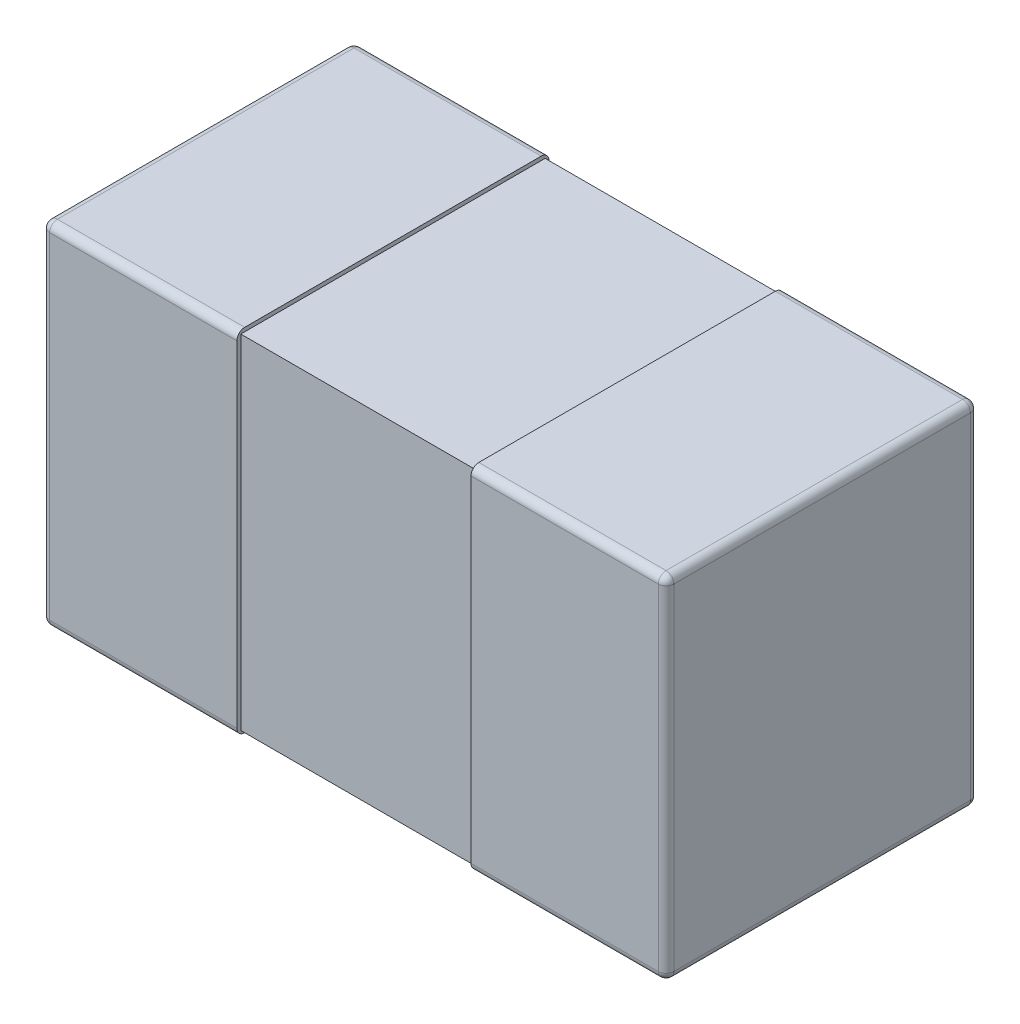
ISO-10303-21;
HEADER;
FILE_DESCRIPTION(('STEP AP214'),'2;1');
FILE_NAME('part.step','',(''),(''),'','','');
FILE_SCHEMA(('AUTOMOTIVE_DESIGN { 1 0 10303 214 1 1 1 1 }'));
ENDSEC;
DATA;
#1=APPLICATION_CONTEXT('core data for automotive mechanical design processes');
#2=APPLICATION_PROTOCOL_DEFINITION('international standard','automotive_design',2000,#1);
#3=PRODUCT_CONTEXT('',#1,'mechanical');
#4=PRODUCT('Part','Part','',(#3));
#5=PRODUCT_RELATED_PRODUCT_CATEGORY('part','',(#4));
#6=PRODUCT_DEFINITION_FORMATION('','',#4);
#7=PRODUCT_DEFINITION_CONTEXT('part definition',#1,'design');
#8=PRODUCT_DEFINITION('design','',#6,#7);
#9=PRODUCT_DEFINITION_SHAPE('','',#8);
#10=(LENGTH_UNIT() NAMED_UNIT(*) SI_UNIT(.MILLI.,.METRE.));
#11=(NAMED_UNIT(*) PLANE_ANGLE_UNIT() SI_UNIT($,.RADIAN.));
#12=(NAMED_UNIT(*) SI_UNIT($,.STERADIAN.) SOLID_ANGLE_UNIT());
#13=UNCERTAINTY_MEASURE_WITH_UNIT(LENGTH_MEASURE(1.E-05),#10,'distance_accuracy_value','');
#14=(GEOMETRIC_REPRESENTATION_CONTEXT(3) GLOBAL_UNCERTAINTY_ASSIGNED_CONTEXT((#13)) GLOBAL_UNIT_ASSIGNED_CONTEXT((#10,
#11,#12)) REPRESENTATION_CONTEXT('',''));
#15=CARTESIAN_POINT('',(0.,0.,0.));
#16=DIRECTION('',(0.,0.,1.));
#17=DIRECTION('',(1.,0.,0.));
#18=AXIS2_PLACEMENT_3D('',#15,#16,#17);
#19=CARTESIAN_POINT('',(0.8,0.9,0.4));
#20=DIRECTION('',(-1.,0.,0.));
#21=DIRECTION('',(0.,0.,1.));
#22=AXIS2_PLACEMENT_3D('',#19,#20,#21);
#23=PLANE('',#22);
#24=DIRECTION('',(0.,1.,0.));
#25=VECTOR('',#24,1.);
#26=CARTESIAN_POINT('',(0.8,0.9,-0.38));
#27=LINE('',#26,#25);
#28=CARTESIAN_POINT('',(0.8,0.88,-0.38));
#29=VERTEX_POINT('',#28);
#30=CARTESIAN_POINT('',(0.8,0.02,-0.38));
#31=VERTEX_POINT('',#30);
#32=EDGE_CURVE('E326',#29,#31,#27,.F.);
#33=ORIENTED_EDGE('',*,*,#32,.F.);
#34=DIRECTION('',(0.,0.,1.));
#35=VECTOR('',#34,1.);
#36=CARTESIAN_POINT('',(0.8,0.88,0.));
#37=LINE('',#36,#35);
#38=CARTESIAN_POINT('',(0.8,0.88,0.38));
#39=VERTEX_POINT('',#38);
#40=EDGE_CURVE('E332',#39,#29,#37,.F.);
#41=ORIENTED_EDGE('',*,*,#40,.F.);
#42=DIRECTION('',(0.,-1.,0.));
#43=VECTOR('',#42,1.);
#44=CARTESIAN_POINT('',(0.8,0.9,0.38));
#45=LINE('',#44,#43);
#46=CARTESIAN_POINT('',(0.8,0.02,0.38));
#47=VERTEX_POINT('',#46);
#48=EDGE_CURVE('E288',#47,#39,#45,.F.);
#49=ORIENTED_EDGE('',*,*,#48,.F.);
#50=DIRECTION('',(0.,0.,-1.));
#51=VECTOR('',#50,1.);
#52=CARTESIAN_POINT('',(0.8,0.02,0.4));
#53=LINE('',#52,#51);
#54=EDGE_CURVE('E341',#31,#47,#53,.F.);
#55=ORIENTED_EDGE('',*,*,#54,.F.);
#56=EDGE_LOOP('',(#33,#41,#49,#55));
#57=FACE_BOUND('',#56,.T.);
#58=ADVANCED_FACE('F17',(#57),#23,.F.);
#59=CARTESIAN_POINT('',(0.78,0.9,-0.38));
#60=DIRECTION('',(0.,1.,0.));
#61=DIRECTION('',(0.,0.,1.));
#62=AXIS2_PLACEMENT_3D('',#59,#60,#61);
#63=CYLINDRICAL_SURFACE('',#62,0.02);
#64=CARTESIAN_POINT('',(0.78,0.02,-0.38));
#65=DIRECTION('',(0.,1.,0.));
#66=DIRECTION('',(1.,0.,0.));
#67=AXIS2_PLACEMENT_3D('',#64,#65,#66);
#68=CIRCLE('',#67,0.02);
#69=CARTESIAN_POINT('',(0.78,0.02,-0.4));
#70=VERTEX_POINT('',#69);
#71=EDGE_CURVE('E322',#70,#31,#68,.F.);
#72=ORIENTED_EDGE('',*,*,#71,.F.);
#73=DIRECTION('',(0.,1.,0.));
#74=VECTOR('',#73,1.);
#75=CARTESIAN_POINT('',(0.78,0.9,-0.4));
#76=LINE('',#75,#74);
#77=CARTESIAN_POINT('',(0.78,0.88,-0.4));
#78=VERTEX_POINT('',#77);
#79=EDGE_CURVE('E246',#78,#70,#76,.F.);
#80=ORIENTED_EDGE('',*,*,#79,.F.);
#81=CARTESIAN_POINT('',(0.78,0.88,-0.38));
#82=DIRECTION('',(0.,1.,0.));
#83=DIRECTION('',(1.,0.,0.));
#84=AXIS2_PLACEMENT_3D('',#81,#82,#83);
#85=CIRCLE('',#84,0.02);
#86=EDGE_CURVE('E250',#29,#78,#85,.T.);
#87=ORIENTED_EDGE('',*,*,#86,.F.);
#88=ORIENTED_EDGE('',*,*,#32,.T.);
#89=EDGE_LOOP('',(#72,#80,#87,#88));
#90=FACE_BOUND('',#89,.T.);
#91=ADVANCED_FACE('F315',(#90),#63,.T.);
#92=CARTESIAN_POINT('',(0.78,0.02,-0.38));
#93=DIRECTION('',(1.,0.,0.));
#94=DIRECTION('',(0.,0.,-1.));
#95=AXIS2_PLACEMENT_3D('',#92,#93,#94);
#96=SPHERICAL_SURFACE('',#95,0.02);
#97=CARTESIAN_POINT('',(0.78,0.02,-0.38));
#98=DIRECTION('',(0.,0.,-1.));
#99=DIRECTION('',(-1.,0.,0.));
#100=AXIS2_PLACEMENT_3D('',#97,#98,#99);
#101=CIRCLE('',#100,0.02);
#102=CARTESIAN_POINT('',(0.78,0.,-0.38));
#103=VERTEX_POINT('',#102);
#104=EDGE_CURVE('E325',#103,#31,#101,.F.);
#105=ORIENTED_EDGE('',*,*,#104,.F.);
#106=CARTESIAN_POINT('',(0.78,0.02,-0.38));
#107=DIRECTION('',(-1.,0.,0.));
#108=DIRECTION('',(0.,0.,1.));
#109=AXIS2_PLACEMENT_3D('',#106,#107,#108);
#110=CIRCLE('',#109,0.02);
#111=EDGE_CURVE('E188',#70,#103,#110,.T.);
#112=ORIENTED_EDGE('',*,*,#111,.F.);
#113=ORIENTED_EDGE('',*,*,#71,.T.);
#114=EDGE_LOOP('',(#105,#112,#113));
#115=FACE_BOUND('',#114,.T.);
#116=ADVANCED_FACE('F311',(#115),#96,.T.);
#117=CARTESIAN_POINT('',(0.78,0.02,0.4));
#118=DIRECTION('',(0.,0.,-1.));
#119=DIRECTION('',(-1.,0.,0.));
#120=AXIS2_PLACEMENT_3D('',#117,#118,#119);
#121=CYLINDRICAL_SURFACE('',#120,0.02);
#122=ORIENTED_EDGE('',*,*,#104,.T.);
#123=ORIENTED_EDGE('',*,*,#54,.T.);
#124=CARTESIAN_POINT('',(0.78,0.02,0.38));
#125=DIRECTION('',(0.,0.,-1.));
#126=DIRECTION('',(1.,0.,0.));
#127=AXIS2_PLACEMENT_3D('',#124,#125,#126);
#128=CIRCLE('',#127,0.02);
#129=CARTESIAN_POINT('',(0.78,0.,0.38));
#130=VERTEX_POINT('',#129);
#131=EDGE_CURVE('E298',#130,#47,#128,.F.);
#132=ORIENTED_EDGE('',*,*,#131,.F.);
#133=DIRECTION('',(0.,0.,1.));
#134=VECTOR('',#133,1.);
#135=CARTESIAN_POINT('',(0.78,0.,0.));
#136=LINE('',#135,#134);
#137=EDGE_CURVE('E192',#130,#103,#136,.F.);
#138=ORIENTED_EDGE('',*,*,#137,.T.);
#139=EDGE_LOOP('',(#122,#123,#132,#138));
#140=FACE_BOUND('',#139,.T.);
#141=ADVANCED_FACE('F307',(#140),#121,.T.);
#142=CARTESIAN_POINT('',(0.78,0.02,0.38));
#143=DIRECTION('',(1.,0.,0.));
#144=DIRECTION('',(0.,0.,-1.));
#145=AXIS2_PLACEMENT_3D('',#142,#143,#144);
#146=SPHERICAL_SURFACE('',#145,0.02);
#147=CARTESIAN_POINT('',(0.78,0.02,0.38));
#148=DIRECTION('',(1.,0.,0.));
#149=DIRECTION('',(0.,0.,-1.));
#150=AXIS2_PLACEMENT_3D('',#147,#148,#149);
#151=CIRCLE('',#150,0.02);
#152=CARTESIAN_POINT('',(0.78,0.0200000000000001,0.4));
#153=VERTEX_POINT('',#152);
#154=EDGE_CURVE('E240',#130,#153,#151,.F.);
#155=ORIENTED_EDGE('',*,*,#154,.F.);
#156=ORIENTED_EDGE('',*,*,#131,.T.);
#157=CARTESIAN_POINT('',(0.78,0.0200000000000001,0.38));
#158=DIRECTION('',(0.,-1.,0.));
#159=DIRECTION('',(0.,0.,-1.));
#160=AXIS2_PLACEMENT_3D('',#157,#158,#159);
#161=CIRCLE('',#160,0.02);
#162=EDGE_CURVE('E295',#153,#47,#161,.F.);
#163=ORIENTED_EDGE('',*,*,#162,.F.);
#164=EDGE_LOOP('',(#155,#156,#163));
#165=FACE_BOUND('',#164,.T.);
#166=ADVANCED_FACE('F304',(#165),#146,.T.);
#167=CARTESIAN_POINT('',(0.78,0.9,0.38));
#168=DIRECTION('',(0.,-1.,0.));
#169=DIRECTION('',(0.,0.,-1.));
#170=AXIS2_PLACEMENT_3D('',#167,#168,#169);
#171=CYLINDRICAL_SURFACE('',#170,0.02);
#172=ORIENTED_EDGE('',*,*,#162,.T.);
#173=ORIENTED_EDGE('',*,*,#48,.T.);
#174=CARTESIAN_POINT('',(0.78,0.88,0.38));
#175=DIRECTION('',(0.,-1.,0.));
#176=DIRECTION('',(1.,0.,0.));
#177=AXIS2_PLACEMENT_3D('',#174,#175,#176);
#178=CIRCLE('',#177,0.02);
#179=CARTESIAN_POINT('',(0.78,0.88,0.4));
#180=VERTEX_POINT('',#179);
#181=EDGE_CURVE('E284',#180,#39,#178,.F.);
#182=ORIENTED_EDGE('',*,*,#181,.F.);
#183=DIRECTION('',(0.,1.,0.));
#184=VECTOR('',#183,1.);
#185=CARTESIAN_POINT('',(0.78,0.9,0.4));
#186=LINE('',#185,#184);
#187=EDGE_CURVE('E236',#180,#153,#186,.F.);
#188=ORIENTED_EDGE('',*,*,#187,.T.);
#189=EDGE_LOOP('',(#172,#173,#182,#188));
#190=FACE_BOUND('',#189,.T.);
#191=ADVANCED_FACE('F276',(#190),#171,.T.);
#192=CARTESIAN_POINT('',(0.78,0.88,0.38));
#193=DIRECTION('',(1.,0.,0.));
#194=DIRECTION('',(0.,0.,-1.));
#195=AXIS2_PLACEMENT_3D('',#192,#193,#194);
#196=SPHERICAL_SURFACE('',#195,0.02);
#197=CARTESIAN_POINT('',(0.78,0.88,0.38));
#198=DIRECTION('',(-1.,0.,0.));
#199=DIRECTION('',(0.,0.,1.));
#200=AXIS2_PLACEMENT_3D('',#197,#198,#199);
#201=CIRCLE('',#200,0.02);
#202=CARTESIAN_POINT('',(0.78,0.9,0.38));
#203=VERTEX_POINT('',#202);
#204=EDGE_CURVE('E231',#180,#203,#201,.T.);
#205=ORIENTED_EDGE('',*,*,#204,.F.);
#206=ORIENTED_EDGE('',*,*,#181,.T.);
#207=CARTESIAN_POINT('',(0.78,0.88,0.38));
#208=DIRECTION('',(0.,0.,1.));
#209=DIRECTION('',(1.,0.,0.));
#210=AXIS2_PLACEMENT_3D('',#207,#208,#209);
#211=CIRCLE('',#210,0.02);
#212=EDGE_CURVE('E287',#203,#39,#211,.F.);
#213=ORIENTED_EDGE('',*,*,#212,.F.);
#214=EDGE_LOOP('',(#205,#206,#213));
#215=FACE_BOUND('',#214,.T.);
#216=ADVANCED_FACE('F271',(#215),#196,.T.);
#217=CARTESIAN_POINT('',(0.78,0.88,0.));
#218=DIRECTION('',(0.,0.,1.));
#219=DIRECTION('',(1.,0.,0.));
#220=AXIS2_PLACEMENT_3D('',#217,#218,#219);
#221=CYLINDRICAL_SURFACE('',#220,0.02);
#222=CARTESIAN_POINT('',(0.78,0.88,-0.38));
#223=DIRECTION('',(0.,0.,1.));
#224=DIRECTION('',(1.,0.,0.));
#225=AXIS2_PLACEMENT_3D('',#222,#223,#224);
#226=CIRCLE('',#225,0.02);
#227=CARTESIAN_POINT('',(0.78,0.9,-0.38));
#228=VERTEX_POINT('',#227);
#229=EDGE_CURVE('E335',#228,#29,#226,.F.);
#230=ORIENTED_EDGE('',*,*,#229,.F.);
#231=DIRECTION('',(0.,0.,1.));
#232=VECTOR('',#231,1.);
#233=CARTESIAN_POINT('',(0.78,0.9,0.));
#234=LINE('',#233,#232);
#235=EDGE_CURVE('E225',#203,#228,#234,.F.);
#236=ORIENTED_EDGE('',*,*,#235,.F.);
#237=ORIENTED_EDGE('',*,*,#212,.T.);
#238=ORIENTED_EDGE('',*,*,#40,.T.);
#239=EDGE_LOOP('',(#230,#236,#237,#238));
#240=FACE_BOUND('',#239,.T.);
#241=ADVANCED_FACE('F266',(#240),#221,.T.);
#242=CARTESIAN_POINT('',(0.78,0.88,-0.38));
#243=DIRECTION('',(1.,0.,0.));
#244=DIRECTION('',(0.,0.,-1.));
#245=AXIS2_PLACEMENT_3D('',#242,#243,#244);
#246=SPHERICAL_SURFACE('',#245,0.02);
#247=ORIENTED_EDGE('',*,*,#229,.T.);
#248=ORIENTED_EDGE('',*,*,#86,.T.);
#249=CARTESIAN_POINT('',(0.78,0.88,-0.38));
#250=DIRECTION('',(1.,0.,0.));
#251=DIRECTION('',(0.,0.,-1.));
#252=AXIS2_PLACEMENT_3D('',#249,#250,#251);
#253=CIRCLE('',#252,0.02);
#254=EDGE_CURVE('E211',#228,#78,#253,.F.);
#255=ORIENTED_EDGE('',*,*,#254,.F.);
#256=EDGE_LOOP('',(#247,#248,#255));
#257=FACE_BOUND('',#256,.T.);
#258=ADVANCED_FACE('F261',(#257),#246,.T.);
#259=CARTESIAN_POINT('',(0.3,0.9,-0.4));
#260=DIRECTION('',(0.,0.,-1.));
#261=DIRECTION('',(-1.,0.,0.));
#262=AXIS2_PLACEMENT_3D('',#259,#260,#261);
#263=PLANE('',#262);
#264=DIRECTION('',(0.,1.,0.));
#265=VECTOR('',#264,1.);
#266=CARTESIAN_POINT('',(0.3,0.9,-0.4));
#267=LINE('',#266,#265);
#268=CARTESIAN_POINT('',(0.3,0.88,-0.4));
#269=VERTEX_POINT('',#268);
#270=CARTESIAN_POINT('',(0.3,0.02,-0.4));
#271=VERTEX_POINT('',#270);
#272=EDGE_CURVE('E207',#269,#271,#267,.F.);
#273=ORIENTED_EDGE('',*,*,#272,.F.);
#274=DIRECTION('',(1.,0.,0.));
#275=VECTOR('',#274,1.);
#276=CARTESIAN_POINT('',(0.3,0.88,-0.4));
#277=LINE('',#276,#275);
#278=EDGE_CURVE('E208',#78,#269,#277,.F.);
#279=ORIENTED_EDGE('',*,*,#278,.F.);
#280=ORIENTED_EDGE('',*,*,#79,.T.);
#281=DIRECTION('',(-1.,0.,0.));
#282=VECTOR('',#281,1.);
#283=CARTESIAN_POINT('',(0.,0.02,-0.4));
#284=LINE('',#283,#282);
#285=EDGE_CURVE('E176',#271,#70,#284,.F.);
#286=ORIENTED_EDGE('',*,*,#285,.F.);
#287=EDGE_LOOP('',(#273,#279,#280,#286));
#288=FACE_BOUND('',#287,.T.);
#289=ADVANCED_FACE('F265',(#288),#263,.T.);
#290=CARTESIAN_POINT('',(0.,0.02,-0.38));
#291=DIRECTION('',(-1.,0.,0.));
#292=DIRECTION('',(0.,0.,1.));
#293=AXIS2_PLACEMENT_3D('',#290,#291,#292);
#294=CYLINDRICAL_SURFACE('',#293,0.02);
#295=ORIENTED_EDGE('',*,*,#111,.T.);
#296=DIRECTION('',(1.,0.,0.));
#297=VECTOR('',#296,1.);
#298=CARTESIAN_POINT('',(0.,0.,-0.38));
#299=LINE('',#298,#297);
#300=CARTESIAN_POINT('',(0.3,0.,-0.38));
#301=VERTEX_POINT('',#300);
#302=EDGE_CURVE('E182',#103,#301,#299,.F.);
#303=ORIENTED_EDGE('',*,*,#302,.T.);
#304=CARTESIAN_POINT('',(0.3,0.02,-0.38));
#305=DIRECTION('',(-1.,0.,0.));
#306=DIRECTION('',(0.,0.,1.));
#307=AXIS2_PLACEMENT_3D('',#304,#305,#306);
#308=CIRCLE('',#307,0.02);
#309=EDGE_CURVE('E20',#271,#301,#308,.T.);
#310=ORIENTED_EDGE('',*,*,#309,.F.);
#311=ORIENTED_EDGE('',*,*,#285,.T.);
#312=EDGE_LOOP('',(#295,#303,#310,#311));
#313=FACE_BOUND('',#312,.T.);
#314=ADVANCED_FACE('F184',(#313),#294,.T.);
#315=CARTESIAN_POINT('',(0.,0.,0.));
#316=DIRECTION('',(0.,1.,0.));
#317=DIRECTION('',(0.,0.,1.));
#318=AXIS2_PLACEMENT_3D('',#315,#316,#317);
#319=PLANE('',#318);
#320=ORIENTED_EDGE('',*,*,#302,.F.);
#321=ORIENTED_EDGE('',*,*,#137,.F.);
#322=DIRECTION('',(1.,0.,0.));
#323=VECTOR('',#322,1.);
#324=CARTESIAN_POINT('',(0.3,0.,0.38));
#325=LINE('',#324,#323);
#326=CARTESIAN_POINT('',(0.3,0.,0.38));
#327=VERTEX_POINT('',#326);
#328=EDGE_CURVE('E191',#327,#130,#325,.T.);
#329=ORIENTED_EDGE('',*,*,#328,.F.);
#330=DIRECTION('',(0.,0.,1.));
#331=VECTOR('',#330,1.);
#332=CARTESIAN_POINT('',(0.3,0.,0.4));
#333=LINE('',#332,#331);
#334=EDGE_CURVE('E195',#301,#327,#333,.T.);
#335=ORIENTED_EDGE('',*,*,#334,.F.);
#336=EDGE_LOOP('',(#320,#321,#329,#335));
#337=FACE_BOUND('',#336,.T.);
#338=ADVANCED_FACE('F196',(#337),#319,.F.);
#339=CARTESIAN_POINT('',(0.3,0.02,0.38));
#340=DIRECTION('',(1.,0.,0.));
#341=DIRECTION('',(0.,0.,-1.));
#342=AXIS2_PLACEMENT_3D('',#339,#340,#341);
#343=CYLINDRICAL_SURFACE('',#342,0.02);
#344=ORIENTED_EDGE('',*,*,#154,.T.);
#345=DIRECTION('',(-1.,0.,0.));
#346=VECTOR('',#345,1.);
#347=CARTESIAN_POINT('',(0.3,0.0200000000000001,0.4));
#348=LINE('',#347,#346);
#349=CARTESIAN_POINT('',(0.3,0.02,0.4));
#350=VERTEX_POINT('',#349);
#351=EDGE_CURVE('E234',#153,#350,#348,.T.);
#352=ORIENTED_EDGE('',*,*,#351,.T.);
#353=CARTESIAN_POINT('',(0.3,0.02,0.38));
#354=DIRECTION('',(1.,0.,0.));
#355=DIRECTION('',(0.,0.,-1.));
#356=AXIS2_PLACEMENT_3D('',#353,#354,#355);
#357=CIRCLE('',#356,0.02);
#358=EDGE_CURVE('E201',#327,#350,#357,.F.);
#359=ORIENTED_EDGE('',*,*,#358,.F.);
#360=ORIENTED_EDGE('',*,*,#328,.T.);
#361=EDGE_LOOP('',(#344,#352,#359,#360));
#362=FACE_BOUND('',#361,.T.);
#363=ADVANCED_FACE('F572',(#362),#343,.T.);
#364=CARTESIAN_POINT('',(0.3,0.9,0.4));
#365=DIRECTION('',(0.,0.,-1.));
#366=DIRECTION('',(-1.,0.,0.));
#367=AXIS2_PLACEMENT_3D('',#364,#365,#366);
#368=PLANE('',#367);
#369=ORIENTED_EDGE('',*,*,#351,.F.);
#370=ORIENTED_EDGE('',*,*,#187,.F.);
#371=DIRECTION('',(-1.,0.,0.));
#372=VECTOR('',#371,1.);
#373=CARTESIAN_POINT('',(0.,0.88,0.4));
#374=LINE('',#373,#372);
#375=CARTESIAN_POINT('',(0.3,0.88,0.4));
#376=VERTEX_POINT('',#375);
#377=EDGE_CURVE('E228',#376,#180,#374,.F.);
#378=ORIENTED_EDGE('',*,*,#377,.F.);
#379=DIRECTION('',(0.,1.,0.));
#380=VECTOR('',#379,1.);
#381=CARTESIAN_POINT('',(0.3,0.9,0.4));
#382=LINE('',#381,#380);
#383=EDGE_CURVE('E361',#350,#376,#382,.T.);
#384=ORIENTED_EDGE('',*,*,#383,.F.);
#385=EDGE_LOOP('',(#369,#370,#378,#384));
#386=FACE_BOUND('',#385,.T.);
#387=ADVANCED_FACE('F568',(#386),#368,.F.);
#388=CARTESIAN_POINT('',(0.,0.88,0.38));
#389=DIRECTION('',(-1.,0.,0.));
#390=DIRECTION('',(0.,0.,1.));
#391=AXIS2_PLACEMENT_3D('',#388,#389,#390);
#392=CYLINDRICAL_SURFACE('',#391,0.02);
#393=CARTESIAN_POINT('',(0.3,0.88,0.38));
#394=DIRECTION('',(-1.,0.,0.));
#395=DIRECTION('',(0.,0.,1.));
#396=AXIS2_PLACEMENT_3D('',#393,#394,#395);
#397=CIRCLE('',#396,0.02);
#398=CARTESIAN_POINT('',(0.3,0.9,0.38));
#399=VERTEX_POINT('',#398);
#400=EDGE_CURVE('E359',#376,#399,#397,.T.);
#401=ORIENTED_EDGE('',*,*,#400,.F.);
#402=ORIENTED_EDGE('',*,*,#377,.T.);
#403=ORIENTED_EDGE('',*,*,#204,.T.);
#404=DIRECTION('',(1.,0.,0.));
#405=VECTOR('',#404,1.);
#406=CARTESIAN_POINT('',(0.,0.9,0.38));
#407=LINE('',#406,#405);
#408=EDGE_CURVE('E220',#399,#203,#407,.T.);
#409=ORIENTED_EDGE('',*,*,#408,.F.);
#410=EDGE_LOOP('',(#401,#402,#403,#409));
#411=FACE_BOUND('',#410,.T.);
#412=ADVANCED_FACE('F564',(#411),#392,.T.);
#413=CARTESIAN_POINT('',(0.,0.9,0.));
#414=DIRECTION('',(0.,1.,0.));
#415=DIRECTION('',(0.,0.,1.));
#416=AXIS2_PLACEMENT_3D('',#413,#414,#415);
#417=PLANE('',#416);
#418=DIRECTION('',(0.,0.,1.));
#419=VECTOR('',#418,1.);
#420=CARTESIAN_POINT('',(0.3,0.9,0.4));
#421=LINE('',#420,#419);
#422=CARTESIAN_POINT('',(0.3,0.9,-0.38));
#423=VERTEX_POINT('',#422);
#424=EDGE_CURVE('E358',#399,#423,#421,.F.);
#425=ORIENTED_EDGE('',*,*,#424,.F.);
#426=ORIENTED_EDGE('',*,*,#408,.T.);
#427=ORIENTED_EDGE('',*,*,#235,.T.);
#428=DIRECTION('',(1.,0.,0.));
#429=VECTOR('',#428,1.);
#430=CARTESIAN_POINT('',(0.3,0.9,-0.38));
#431=LINE('',#430,#429);
#432=EDGE_CURVE('E217',#423,#228,#431,.T.);
#433=ORIENTED_EDGE('',*,*,#432,.F.);
#434=EDGE_LOOP('',(#425,#426,#427,#433));
#435=FACE_BOUND('',#434,.T.);
#436=ADVANCED_FACE('F560',(#435),#417,.T.);
#437=CARTESIAN_POINT('',(0.3,0.88,-0.38));
#438=DIRECTION('',(1.,0.,0.));
#439=DIRECTION('',(0.,0.,-1.));
#440=AXIS2_PLACEMENT_3D('',#437,#438,#439);
#441=CYLINDRICAL_SURFACE('',#440,0.02);
#442=ORIENTED_EDGE('',*,*,#254,.T.);
#443=ORIENTED_EDGE('',*,*,#278,.T.);
#444=CARTESIAN_POINT('',(0.3,0.88,-0.38));
#445=DIRECTION('',(1.,0.,0.));
#446=DIRECTION('',(0.,0.,-1.));
#447=AXIS2_PLACEMENT_3D('',#444,#445,#446);
#448=CIRCLE('',#447,0.02);
#449=EDGE_CURVE('E355',#423,#269,#448,.F.);
#450=ORIENTED_EDGE('',*,*,#449,.F.);
#451=ORIENTED_EDGE('',*,*,#432,.T.);
#452=EDGE_LOOP('',(#442,#443,#450,#451));
#453=FACE_BOUND('',#452,.T.);
#454=ADVANCED_FACE('F557',(#453),#441,.T.);
#455=CARTESIAN_POINT('',(0.3,0.9,0.4));
#456=DIRECTION('',(-1.,0.,0.));
#457=DIRECTION('',(0.,0.,1.));
#458=AXIS2_PLACEMENT_3D('',#455,#456,#457);
#459=PLANE('',#458);
#460=ORIENTED_EDGE('',*,*,#424,.T.);
#461=ORIENTED_EDGE('',*,*,#449,.T.);
#462=ORIENTED_EDGE('',*,*,#272,.T.);
#463=ORIENTED_EDGE('',*,*,#309,.T.);
#464=ORIENTED_EDGE('',*,*,#334,.T.);
#465=ORIENTED_EDGE('',*,*,#358,.T.);
#466=ORIENTED_EDGE('',*,*,#383,.T.);
#467=ORIENTED_EDGE('',*,*,#400,.T.);
#468=EDGE_LOOP('',(#460,#461,#462,#463,#464,#465,#466,#467));
#469=FACE_BOUND('',#468,.T.);
#470=DIRECTION('',(0.,1.,0.));
#471=VECTOR('',#470,1.);
#472=CARTESIAN_POINT('',(0.3,0.89,0.39));
#473=LINE('',#472,#471);
#474=CARTESIAN_POINT('',(0.3,0.89,0.39));
#475=VERTEX_POINT('',#474);
#476=CARTESIAN_POINT('',(0.3,0.01,0.39));
#477=VERTEX_POINT('',#476);
#478=EDGE_CURVE('E357',#475,#477,#473,.F.);
#479=ORIENTED_EDGE('',*,*,#478,.T.);
#480=DIRECTION('',(0.,0.,1.));
#481=VECTOR('',#480,1.);
#482=CARTESIAN_POINT('',(0.3,0.01,0.));
#483=LINE('',#482,#481);
#484=CARTESIAN_POINT('',(0.3,0.01,-0.39));
#485=VERTEX_POINT('',#484);
#486=EDGE_CURVE('E370',#477,#485,#483,.F.);
#487=ORIENTED_EDGE('',*,*,#486,.T.);
#488=DIRECTION('',(0.,1.,0.));
#489=VECTOR('',#488,1.);
#490=CARTESIAN_POINT('',(0.3,0.89,-0.39));
#491=LINE('',#490,#489);
#492=CARTESIAN_POINT('',(0.3,0.89,-0.39));
#493=VERTEX_POINT('',#492);
#494=EDGE_CURVE('E372',#493,#485,#491,.F.);
#495=ORIENTED_EDGE('',*,*,#494,.F.);
#496=DIRECTION('',(0.,0.,1.));
#497=VECTOR('',#496,1.);
#498=CARTESIAN_POINT('',(0.3,0.89,0.));
#499=LINE('',#498,#497);
#500=EDGE_CURVE('E378',#475,#493,#499,.F.);
#501=ORIENTED_EDGE('',*,*,#500,.F.);
#502=EDGE_LOOP('',(#479,#487,#495,#501));
#503=FACE_BOUND('',#502,.T.);
#504=ADVANCED_FACE('F204',(#469,#503),#459,.T.);
#505=CARTESIAN_POINT('',(0.,0.89,0.39));
#506=DIRECTION('',(0.,0.,-1.));
#507=DIRECTION('',(-1.,0.,0.));
#508=AXIS2_PLACEMENT_3D('',#505,#506,#507);
#509=PLANE('',#508);
#510=ORIENTED_EDGE('',*,*,#478,.F.);
#511=DIRECTION('',(1.,0.,0.));
#512=VECTOR('',#511,1.);
#513=CARTESIAN_POINT('',(0.,0.89,0.39));
#514=LINE('',#513,#512);
#515=CARTESIAN_POINT('',(-0.3,0.89,0.39));
#516=VERTEX_POINT('',#515);
#517=EDGE_CURVE('E384',#516,#475,#514,.T.);
#518=ORIENTED_EDGE('',*,*,#517,.F.);
#519=DIRECTION('',(0.,1.,0.));
#520=VECTOR('',#519,1.);
#521=CARTESIAN_POINT('',(-0.3,0.9,0.39));
#522=LINE('',#521,#520);
#523=CARTESIAN_POINT('',(-0.3,0.01,0.39));
#524=VERTEX_POINT('',#523);
#525=EDGE_CURVE('E387',#516,#524,#522,.F.);
#526=ORIENTED_EDGE('',*,*,#525,.T.);
#527=DIRECTION('',(1.,0.,0.));
#528=VECTOR('',#527,1.);
#529=CARTESIAN_POINT('',(0.,0.01,0.39));
#530=LINE('',#529,#528);
#531=EDGE_CURVE('E367',#524,#477,#530,.T.);
#532=ORIENTED_EDGE('',*,*,#531,.T.);
#533=EDGE_LOOP('',(#510,#518,#526,#532));
#534=FACE_BOUND('',#533,.T.);
#535=ADVANCED_FACE('F550',(#534),#509,.F.);
#536=CARTESIAN_POINT('',(0.,0.01,0.));
#537=DIRECTION('',(0.,1.,0.));
#538=DIRECTION('',(0.,0.,1.));
#539=AXIS2_PLACEMENT_3D('',#536,#537,#538);
#540=PLANE('',#539);
#541=ORIENTED_EDGE('',*,*,#486,.F.);
#542=ORIENTED_EDGE('',*,*,#531,.F.);
#543=DIRECTION('',(0.,0.,1.));
#544=VECTOR('',#543,1.);
#545=CARTESIAN_POINT('',(-0.3,0.01,0.));
#546=LINE('',#545,#544);
#547=CARTESIAN_POINT('',(-0.3,0.01,-0.39));
#548=VERTEX_POINT('',#547);
#549=EDGE_CURVE('E498',#524,#548,#546,.F.);
#550=ORIENTED_EDGE('',*,*,#549,.T.);
#551=DIRECTION('',(-1.,0.,0.));
#552=VECTOR('',#551,1.);
#553=CARTESIAN_POINT('',(0.,0.01,-0.39));
#554=LINE('',#553,#552);
#555=EDGE_CURVE('E375',#485,#548,#554,.T.);
#556=ORIENTED_EDGE('',*,*,#555,.F.);
#557=EDGE_LOOP('',(#541,#542,#550,#556));
#558=FACE_BOUND('',#557,.T.);
#559=ADVANCED_FACE('F546',(#558),#540,.F.);
#560=CARTESIAN_POINT('',(0.,0.89,-0.39));
#561=DIRECTION('',(0.,0.,-1.));
#562=DIRECTION('',(-1.,0.,0.));
#563=AXIS2_PLACEMENT_3D('',#560,#561,#562);
#564=PLANE('',#563);
#565=DIRECTION('',(0.,1.,0.));
#566=VECTOR('',#565,1.);
#567=CARTESIAN_POINT('',(-0.3,0.9,-0.39));
#568=LINE('',#567,#566);
#569=CARTESIAN_POINT('',(-0.3,0.89,-0.39));
#570=VERTEX_POINT('',#569);
#571=EDGE_CURVE('E500',#548,#570,#568,.T.);
#572=ORIENTED_EDGE('',*,*,#571,.T.);
#573=DIRECTION('',(1.,0.,0.));
#574=VECTOR('',#573,1.);
#575=CARTESIAN_POINT('',(0.,0.89,-0.39));
#576=LINE('',#575,#574);
#577=EDGE_CURVE('E381',#493,#570,#576,.F.);
#578=ORIENTED_EDGE('',*,*,#577,.F.);
#579=ORIENTED_EDGE('',*,*,#494,.T.);
#580=ORIENTED_EDGE('',*,*,#555,.T.);
#581=EDGE_LOOP('',(#572,#578,#579,#580));
#582=FACE_BOUND('',#581,.T.);
#583=ADVANCED_FACE('F542',(#582),#564,.T.);
#584=CARTESIAN_POINT('',(0.,0.89,0.));
#585=DIRECTION('',(0.,1.,0.));
#586=DIRECTION('',(0.,0.,1.));
#587=AXIS2_PLACEMENT_3D('',#584,#585,#586);
#588=PLANE('',#587);
#589=DIRECTION('',(0.,0.,1.));
#590=VECTOR('',#589,1.);
#591=CARTESIAN_POINT('',(-0.3,0.89,0.));
#592=LINE('',#591,#590);
#593=EDGE_CURVE('E354',#570,#516,#592,.T.);
#594=ORIENTED_EDGE('',*,*,#593,.T.);
#595=ORIENTED_EDGE('',*,*,#517,.T.);
#596=ORIENTED_EDGE('',*,*,#500,.T.);
#597=ORIENTED_EDGE('',*,*,#577,.T.);
#598=EDGE_LOOP('',(#594,#595,#596,#597));
#599=FACE_BOUND('',#598,.T.);
#600=ADVANCED_FACE('F538',(#599),#588,.T.);
#601=CARTESIAN_POINT('',(0.,0.02,0.38));
#602=DIRECTION('',(1.,0.,0.));
#603=DIRECTION('',(0.,0.,-1.));
#604=AXIS2_PLACEMENT_3D('',#601,#602,#603);
#605=CYLINDRICAL_SURFACE('',#604,0.02);
#606=CARTESIAN_POINT('',(-0.78,0.02,0.38));
#607=DIRECTION('',(1.,0.,0.));
#608=DIRECTION('',(0.,0.,-1.));
#609=AXIS2_PLACEMENT_3D('',#606,#607,#608);
#610=CIRCLE('',#609,0.02);
#611=CARTESIAN_POINT('',(-0.78,0.,0.38));
#612=VERTEX_POINT('',#611);
#613=CARTESIAN_POINT('',(-0.78,0.0200000000000001,0.4));
#614=VERTEX_POINT('',#613);
#615=EDGE_CURVE('E402',#612,#614,#610,.F.);
#616=ORIENTED_EDGE('',*,*,#615,.F.);
#617=DIRECTION('',(1.,0.,0.));
#618=VECTOR('',#617,1.);
#619=CARTESIAN_POINT('',(0.,0.,0.38));
#620=LINE('',#619,#618);
#621=CARTESIAN_POINT('',(-0.3,0.,0.38));
#622=VERTEX_POINT('',#621);
#623=EDGE_CURVE('E398',#612,#622,#620,.T.);
#624=ORIENTED_EDGE('',*,*,#623,.T.);
#625=CARTESIAN_POINT('',(-0.3,0.02,0.38));
#626=DIRECTION('',(1.,0.,0.));
#627=DIRECTION('',(0.,0.,-1.));
#628=AXIS2_PLACEMENT_3D('',#625,#626,#627);
#629=CIRCLE('',#628,0.02);
#630=CARTESIAN_POINT('',(-0.3,0.02,0.4));
#631=VERTEX_POINT('',#630);
#632=EDGE_CURVE('E348',#622,#631,#629,.F.);
#633=ORIENTED_EDGE('',*,*,#632,.T.);
#634=DIRECTION('',(1.,0.,0.));
#635=VECTOR('',#634,1.);
#636=CARTESIAN_POINT('',(0.,0.0200000000000001,0.4));
#637=LINE('',#636,#635);
#638=EDGE_CURVE('E431',#614,#631,#637,.T.);
#639=ORIENTED_EDGE('',*,*,#638,.F.);
#640=EDGE_LOOP('',(#616,#624,#633,#639));
#641=FACE_BOUND('',#640,.T.);
#642=ADVANCED_FACE('F534',(#641),#605,.T.);
#643=CARTESIAN_POINT('',(0.,0.88,0.38));
#644=DIRECTION('',(-1.,0.,0.));
#645=DIRECTION('',(0.,0.,1.));
#646=AXIS2_PLACEMENT_3D('',#643,#644,#645);
#647=CYLINDRICAL_SURFACE('',#646,0.02);
#648=CARTESIAN_POINT('',(-0.78,0.88,0.38));
#649=DIRECTION('',(1.,0.,0.));
#650=DIRECTION('',(0.,0.,-1.));
#651=AXIS2_PLACEMENT_3D('',#648,#649,#650);
#652=CIRCLE('',#651,0.02);
#653=CARTESIAN_POINT('',(-0.78,0.88,0.4));
#654=VERTEX_POINT('',#653);
#655=CARTESIAN_POINT('',(-0.78,0.9,0.38));
#656=VERTEX_POINT('',#655);
#657=EDGE_CURVE('E435',#654,#656,#652,.F.);
#658=ORIENTED_EDGE('',*,*,#657,.F.);
#659=DIRECTION('',(1.,0.,0.));
#660=VECTOR('',#659,1.);
#661=CARTESIAN_POINT('',(0.,0.88,0.4));
#662=LINE('',#661,#660);
#663=CARTESIAN_POINT('',(-0.3,0.88,0.4));
#664=VERTEX_POINT('',#663);
#665=EDGE_CURVE('E432',#664,#654,#662,.F.);
#666=ORIENTED_EDGE('',*,*,#665,.F.);
#667=CARTESIAN_POINT('',(-0.3,0.88,0.38));
#668=DIRECTION('',(-1.,0.,0.));
#669=DIRECTION('',(0.,0.,1.));
#670=AXIS2_PLACEMENT_3D('',#667,#668,#669);
#671=CIRCLE('',#670,0.02);
#672=CARTESIAN_POINT('',(-0.3,0.9,0.38));
#673=VERTEX_POINT('',#672);
#674=EDGE_CURVE('E352',#664,#673,#671,.T.);
#675=ORIENTED_EDGE('',*,*,#674,.T.);
#676=DIRECTION('',(1.,0.,0.));
#677=VECTOR('',#676,1.);
#678=CARTESIAN_POINT('',(0.,0.9,0.38));
#679=LINE('',#678,#677);
#680=EDGE_CURVE('E443',#656,#673,#679,.T.);
#681=ORIENTED_EDGE('',*,*,#680,.F.);
#682=EDGE_LOOP('',(#658,#666,#675,#681));
#683=FACE_BOUND('',#682,.T.);
#684=ADVANCED_FACE('F530',(#683),#647,.T.);
#685=CARTESIAN_POINT('',(0.,0.88,-0.38));
#686=DIRECTION('',(1.,0.,0.));
#687=DIRECTION('',(0.,0.,-1.));
#688=AXIS2_PLACEMENT_3D('',#685,#686,#687);
#689=CYLINDRICAL_SURFACE('',#688,0.02);
#690=CARTESIAN_POINT('',(-0.78,0.88,-0.38));
#691=DIRECTION('',(1.,0.,0.));
#692=DIRECTION('',(0.,0.,-1.));
#693=AXIS2_PLACEMENT_3D('',#690,#691,#692);
#694=CIRCLE('',#693,0.02);
#695=CARTESIAN_POINT('',(-0.78,0.9,-0.380000000000024));
#696=VERTEX_POINT('',#695);
#697=CARTESIAN_POINT('',(-0.78,0.88,-0.4));
#698=VERTEX_POINT('',#697);
#699=EDGE_CURVE('E446',#696,#698,#694,.F.);
#700=ORIENTED_EDGE('',*,*,#699,.F.);
#701=DIRECTION('',(1.,0.,0.));
#702=VECTOR('',#701,1.);
#703=CARTESIAN_POINT('',(0.,0.9,-0.38));
#704=LINE('',#703,#702);
#705=CARTESIAN_POINT('',(-0.3,0.9,-0.38));
#706=VERTEX_POINT('',#705);
#707=EDGE_CURVE('E447',#706,#696,#704,.F.);
#708=ORIENTED_EDGE('',*,*,#707,.F.);
#709=CARTESIAN_POINT('',(-0.3,0.88,-0.38));
#710=DIRECTION('',(1.,0.,0.));
#711=DIRECTION('',(0.,0.,-1.));
#712=AXIS2_PLACEMENT_3D('',#709,#710,#711);
#713=CIRCLE('',#712,0.02);
#714=CARTESIAN_POINT('',(-0.3,0.88,-0.4));
#715=VERTEX_POINT('',#714);
#716=EDGE_CURVE('E350',#706,#715,#713,.F.);
#717=ORIENTED_EDGE('',*,*,#716,.T.);
#718=DIRECTION('',(1.,0.,0.));
#719=VECTOR('',#718,1.);
#720=CARTESIAN_POINT('',(0.,0.88,-0.4));
#721=LINE('',#720,#719);
#722=EDGE_CURVE('E471',#715,#698,#721,.F.);
#723=ORIENTED_EDGE('',*,*,#722,.T.);
#724=EDGE_LOOP('',(#700,#708,#717,#723));
#725=FACE_BOUND('',#724,.T.);
#726=ADVANCED_FACE('F526',(#725),#689,.T.);
#727=CARTESIAN_POINT('',(-0.3,0.9,0.));
#728=DIRECTION('',(-1.,0.,0.));
#729=DIRECTION('',(0.,0.,1.));
#730=AXIS2_PLACEMENT_3D('',#727,#728,#729);
#731=PLANE('',#730);
#732=ORIENTED_EDGE('',*,*,#632,.F.);
#733=DIRECTION('',(0.,0.,1.));
#734=VECTOR('',#733,1.);
#735=CARTESIAN_POINT('',(-0.3,0.,0.));
#736=LINE('',#735,#734);
#737=CARTESIAN_POINT('',(-0.3,0.,-0.38));
#738=VERTEX_POINT('',#737);
#739=EDGE_CURVE('E399',#622,#738,#736,.F.);
#740=ORIENTED_EDGE('',*,*,#739,.T.);
#741=CARTESIAN_POINT('',(-0.3,0.02,-0.38));
#742=DIRECTION('',(-1.,0.,0.));
#743=DIRECTION('',(0.,0.,1.));
#744=AXIS2_PLACEMENT_3D('',#741,#742,#743);
#745=CIRCLE('',#744,0.02);
#746=CARTESIAN_POINT('',(-0.3,0.02,-0.4));
#747=VERTEX_POINT('',#746);
#748=EDGE_CURVE('E345',#747,#738,#745,.T.);
#749=ORIENTED_EDGE('',*,*,#748,.F.);
#750=DIRECTION('',(0.,1.,0.));
#751=VECTOR('',#750,1.);
#752=CARTESIAN_POINT('',(-0.3,0.9,-0.4));
#753=LINE('',#752,#751);
#754=EDGE_CURVE('E486',#747,#715,#753,.T.);
#755=ORIENTED_EDGE('',*,*,#754,.T.);
#756=ORIENTED_EDGE('',*,*,#716,.F.);
#757=DIRECTION('',(0.,0.,1.));
#758=VECTOR('',#757,1.);
#759=CARTESIAN_POINT('',(-0.3,0.9,0.));
#760=LINE('',#759,#758);
#761=EDGE_CURVE('E448',#673,#706,#760,.F.);
#762=ORIENTED_EDGE('',*,*,#761,.F.);
#763=ORIENTED_EDGE('',*,*,#674,.F.);
#764=DIRECTION('',(0.,1.,0.));
#765=VECTOR('',#764,1.);
#766=CARTESIAN_POINT('',(-0.3,0.9,0.4));
#767=LINE('',#766,#765);
#768=EDGE_CURVE('E436',#631,#664,#767,.T.);
#769=ORIENTED_EDGE('',*,*,#768,.F.);
#770=EDGE_LOOP('',(#732,#740,#749,#755,#756,#762,#763,#769));
#771=FACE_BOUND('',#770,.T.);
#772=ORIENTED_EDGE('',*,*,#571,.F.);
#773=ORIENTED_EDGE('',*,*,#549,.F.);
#774=ORIENTED_EDGE('',*,*,#525,.F.);
#775=ORIENTED_EDGE('',*,*,#593,.F.);
#776=EDGE_LOOP('',(#772,#773,#774,#775));
#777=FACE_BOUND('',#776,.T.);
#778=ADVANCED_FACE('F522',(#771,#777),#731,.F.);
#779=CARTESIAN_POINT('',(0.,0.02,-0.38));
#780=DIRECTION('',(-1.,0.,0.));
#781=DIRECTION('',(0.,0.,1.));
#782=AXIS2_PLACEMENT_3D('',#779,#780,#781);
#783=CYLINDRICAL_SURFACE('',#782,0.02);
#784=CARTESIAN_POINT('',(-0.78,0.02,-0.38));
#785=DIRECTION('',(1.,0.,0.));
#786=DIRECTION('',(0.,0.,-1.));
#787=AXIS2_PLACEMENT_3D('',#784,#785,#786);
#788=CIRCLE('',#787,0.02);
#789=CARTESIAN_POINT('',(-0.78,0.0200000000000001,-0.4));
#790=VERTEX_POINT('',#789);
#791=CARTESIAN_POINT('',(-0.78,0.,-0.38));
#792=VERTEX_POINT('',#791);
#793=EDGE_CURVE('E394',#790,#792,#788,.F.);
#794=ORIENTED_EDGE('',*,*,#793,.F.);
#795=DIRECTION('',(1.,0.,0.));
#796=VECTOR('',#795,1.);
#797=CARTESIAN_POINT('',(0.,0.0200000000000001,-0.4));
#798=LINE('',#797,#796);
#799=EDGE_CURVE('E490',#790,#747,#798,.T.);
#800=ORIENTED_EDGE('',*,*,#799,.T.);
#801=ORIENTED_EDGE('',*,*,#748,.T.);
#802=DIRECTION('',(1.,0.,0.));
#803=VECTOR('',#802,1.);
#804=CARTESIAN_POINT('',(0.,0.,-0.38));
#805=LINE('',#804,#803);
#806=EDGE_CURVE('E347',#738,#792,#805,.F.);
#807=ORIENTED_EDGE('',*,*,#806,.T.);
#808=EDGE_LOOP('',(#794,#800,#801,#807));
#809=FACE_BOUND('',#808,.T.);
#810=ADVANCED_FACE('F518',(#809),#783,.T.);
#811=CARTESIAN_POINT('',(0.,0.,0.));
#812=DIRECTION('',(0.,1.,0.));
#813=DIRECTION('',(0.,0.,1.));
#814=AXIS2_PLACEMENT_3D('',#811,#812,#813);
#815=PLANE('',#814);
#816=ORIENTED_EDGE('',*,*,#623,.F.);
#817=DIRECTION('',(0.,0.,1.));
#818=VECTOR('',#817,1.);
#819=CARTESIAN_POINT('',(-0.78,0.,0.));
#820=LINE('',#819,#818);
#821=EDGE_CURVE('E393',#792,#612,#820,.T.);
#822=ORIENTED_EDGE('',*,*,#821,.F.);
#823=ORIENTED_EDGE('',*,*,#806,.F.);
#824=ORIENTED_EDGE('',*,*,#739,.F.);
#825=EDGE_LOOP('',(#816,#822,#823,#824));
#826=FACE_BOUND('',#825,.T.);
#827=ADVANCED_FACE('F513',(#826),#815,.F.);
#828=CARTESIAN_POINT('',(-0.78,0.02,0.38));
#829=DIRECTION('',(1.,0.,0.));
#830=DIRECTION('',(0.,0.,-1.));
#831=AXIS2_PLACEMENT_3D('',#828,#829,#830);
#832=SPHERICAL_SURFACE('',#831,0.02);
#833=ORIENTED_EDGE('',*,*,#615,.T.);
#834=CARTESIAN_POINT('',(-0.78,0.0200000000000001,0.38));
#835=DIRECTION('',(0.,-1.,0.));
#836=DIRECTION('',(0.,0.,-1.));
#837=AXIS2_PLACEMENT_3D('',#834,#835,#836);
#838=CIRCLE('',#837,0.02);
#839=CARTESIAN_POINT('',(-0.8,0.02,0.38));
#840=VERTEX_POINT('',#839);
#841=EDGE_CURVE('E418',#840,#614,#838,.F.);
#842=ORIENTED_EDGE('',*,*,#841,.F.);
#843=CARTESIAN_POINT('',(-0.78,0.02,0.38));
#844=DIRECTION('',(0.,0.,1.));
#845=DIRECTION('',(1.,0.,0.));
#846=AXIS2_PLACEMENT_3D('',#843,#844,#845);
#847=CIRCLE('',#846,0.02);
#848=EDGE_CURVE('E407',#612,#840,#847,.F.);
#849=ORIENTED_EDGE('',*,*,#848,.F.);
#850=EDGE_LOOP('',(#833,#842,#849));
#851=FACE_BOUND('',#850,.T.);
#852=ADVANCED_FACE('F508',(#851),#832,.T.);
#853=CARTESIAN_POINT('',(0.,0.9,0.4));
#854=DIRECTION('',(0.,0.,1.));
#855=DIRECTION('',(1.,0.,0.));
#856=AXIS2_PLACEMENT_3D('',#853,#854,#855);
#857=PLANE('',#856);
#858=ORIENTED_EDGE('',*,*,#768,.T.);
#859=ORIENTED_EDGE('',*,*,#665,.T.);
#860=DIRECTION('',(0.,-1.,0.));
#861=VECTOR('',#860,1.);
#862=CARTESIAN_POINT('',(-0.78,0.9,0.4));
#863=LINE('',#862,#861);
#864=EDGE_CURVE('E421',#614,#654,#863,.F.);
#865=ORIENTED_EDGE('',*,*,#864,.F.);
#866=ORIENTED_EDGE('',*,*,#638,.T.);
#867=EDGE_LOOP('',(#858,#859,#865,#866));
#868=FACE_BOUND('',#867,.T.);
#869=ADVANCED_FACE('F512',(#868),#857,.T.);
#870=CARTESIAN_POINT('',(-0.78,0.88,0.38));
#871=DIRECTION('',(1.,0.,0.));
#872=DIRECTION('',(0.,0.,-1.));
#873=AXIS2_PLACEMENT_3D('',#870,#871,#872);
#874=SPHERICAL_SURFACE('',#873,0.02);
#875=CARTESIAN_POINT('',(-0.78,0.88,0.38));
#876=DIRECTION('',(0.,0.,-1.));
#877=DIRECTION('',(-1.,0.,0.));
#878=AXIS2_PLACEMENT_3D('',#875,#876,#877);
#879=CIRCLE('',#878,0.02);
#880=CARTESIAN_POINT('',(-0.8,0.88,0.38));
#881=VERTEX_POINT('',#880);
#882=EDGE_CURVE('E456',#881,#656,#879,.T.);
#883=ORIENTED_EDGE('',*,*,#882,.F.);
#884=CARTESIAN_POINT('',(-0.78,0.88,0.38));
#885=DIRECTION('',(0.,-1.,0.));
#886=DIRECTION('',(0.,0.,-1.));
#887=AXIS2_PLACEMENT_3D('',#884,#885,#886);
#888=CIRCLE('',#887,0.02);
#889=EDGE_CURVE('E412',#654,#881,#888,.T.);
#890=ORIENTED_EDGE('',*,*,#889,.F.);
#891=ORIENTED_EDGE('',*,*,#657,.T.);
#892=EDGE_LOOP('',(#883,#890,#891));
#893=FACE_BOUND('',#892,.T.);
#894=ADVANCED_FACE('F625',(#893),#874,.T.);
#895=CARTESIAN_POINT('',(0.,0.9,0.));
#896=DIRECTION('',(0.,1.,0.));
#897=DIRECTION('',(0.,0.,1.));
#898=AXIS2_PLACEMENT_3D('',#895,#896,#897);
#899=PLANE('',#898);
#900=DIRECTION('',(0.,0.,-1.));
#901=VECTOR('',#900,1.);
#902=CARTESIAN_POINT('',(-0.78,0.9,0.));
#903=LINE('',#902,#901);
#904=EDGE_CURVE('E453',#656,#696,#903,.T.);
#905=ORIENTED_EDGE('',*,*,#904,.F.);
#906=ORIENTED_EDGE('',*,*,#680,.T.);
#907=ORIENTED_EDGE('',*,*,#761,.T.);
#908=ORIENTED_EDGE('',*,*,#707,.T.);
#909=EDGE_LOOP('',(#905,#906,#907,#908));
#910=FACE_BOUND('',#909,.T.);
#911=ADVANCED_FACE('F623',(#910),#899,.T.);
#912=CARTESIAN_POINT('',(-0.78,0.88,-0.38));
#913=DIRECTION('',(1.,0.,0.));
#914=DIRECTION('',(0.,0.,-1.));
#915=AXIS2_PLACEMENT_3D('',#912,#913,#914);
#916=SPHERICAL_SURFACE('',#915,0.02);
#917=CARTESIAN_POINT('',(-0.78,0.88,-0.38));
#918=DIRECTION('',(0.,1.,0.));
#919=DIRECTION('',(0.,0.,1.));
#920=AXIS2_PLACEMENT_3D('',#917,#918,#919);
#921=CIRCLE('',#920,0.02);
#922=CARTESIAN_POINT('',(-0.8,0.88,-0.38));
#923=VERTEX_POINT('',#922);
#924=EDGE_CURVE('E35',#923,#698,#921,.F.);
#925=ORIENTED_EDGE('',*,*,#924,.F.);
#926=CARTESIAN_POINT('',(-0.78,0.88,-0.38));
#927=DIRECTION('',(0.,0.,-1.));
#928=DIRECTION('',(-1.,0.,0.));
#929=AXIS2_PLACEMENT_3D('',#926,#927,#928);
#930=CIRCLE('',#929,0.02);
#931=EDGE_CURVE('E426',#696,#923,#930,.F.);
#932=ORIENTED_EDGE('',*,*,#931,.F.);
#933=ORIENTED_EDGE('',*,*,#699,.T.);
#934=EDGE_LOOP('',(#925,#932,#933));
#935=FACE_BOUND('',#934,.T.);
#936=ADVANCED_FACE('F620',(#935),#916,.T.);
#937=CARTESIAN_POINT('',(0.,0.9,-0.4));
#938=DIRECTION('',(0.,0.,1.));
#939=DIRECTION('',(1.,0.,0.));
#940=AXIS2_PLACEMENT_3D('',#937,#938,#939);
#941=PLANE('',#940);
#942=ORIENTED_EDGE('',*,*,#799,.F.);
#943=DIRECTION('',(0.,1.,0.));
#944=VECTOR('',#943,1.);
#945=CARTESIAN_POINT('',(-0.78,0.9,-0.4));
#946=LINE('',#945,#944);
#947=EDGE_CURVE('E467',#698,#790,#946,.F.);
#948=ORIENTED_EDGE('',*,*,#947,.F.);
#949=ORIENTED_EDGE('',*,*,#722,.F.);
#950=ORIENTED_EDGE('',*,*,#754,.F.);
#951=EDGE_LOOP('',(#942,#948,#949,#950));
#952=FACE_BOUND('',#951,.T.);
#953=ADVANCED_FACE('F611',(#952),#941,.F.);
#954=CARTESIAN_POINT('',(-0.78,0.02,-0.38));
#955=DIRECTION('',(1.,0.,0.));
#956=DIRECTION('',(0.,0.,-1.));
#957=AXIS2_PLACEMENT_3D('',#954,#955,#956);
#958=SPHERICAL_SURFACE('',#957,0.02);
#959=ORIENTED_EDGE('',*,*,#793,.T.);
#960=CARTESIAN_POINT('',(-0.78,0.02,-0.38));
#961=DIRECTION('',(0.,0.,1.));
#962=DIRECTION('',(1.,0.,0.));
#963=AXIS2_PLACEMENT_3D('',#960,#961,#962);
#964=CIRCLE('',#963,0.02);
#965=CARTESIAN_POINT('',(-0.8,0.02,-0.38));
#966=VERTEX_POINT('',#965);
#967=EDGE_CURVE('E390',#966,#792,#964,.T.);
#968=ORIENTED_EDGE('',*,*,#967,.F.);
#969=CARTESIAN_POINT('',(-0.78,0.0200000000000001,-0.38));
#970=DIRECTION('',(0.,1.,0.));
#971=DIRECTION('',(0.,0.,1.));
#972=AXIS2_PLACEMENT_3D('',#969,#970,#971);
#973=CIRCLE('',#972,0.02);
#974=EDGE_CURVE('E476',#790,#966,#973,.T.);
#975=ORIENTED_EDGE('',*,*,#974,.F.);
#976=EDGE_LOOP('',(#959,#968,#975));
#977=FACE_BOUND('',#976,.T.);
#978=ADVANCED_FACE('F606',(#977),#958,.T.);
#979=CARTESIAN_POINT('',(-0.78,0.02,0.));
#980=DIRECTION('',(0.,0.,1.));
#981=DIRECTION('',(1.,0.,0.));
#982=AXIS2_PLACEMENT_3D('',#979,#980,#981);
#983=CYLINDRICAL_SURFACE('',#982,0.02);
#984=ORIENTED_EDGE('',*,*,#848,.T.);
#985=DIRECTION('',(0.,0.,1.));
#986=VECTOR('',#985,1.);
#987=CARTESIAN_POINT('',(-0.8,0.0200000000000001,0.));
#988=LINE('',#987,#986);
#989=EDGE_CURVE('E481',#966,#840,#988,.T.);
#990=ORIENTED_EDGE('',*,*,#989,.F.);
#991=ORIENTED_EDGE('',*,*,#967,.T.);
#992=ORIENTED_EDGE('',*,*,#821,.T.);
#993=EDGE_LOOP('',(#984,#990,#991,#992));
#994=FACE_BOUND('',#993,.T.);
#995=ADVANCED_FACE('F602',(#994),#983,.T.);
#996=CARTESIAN_POINT('',(-0.78,0.9,0.38));
#997=DIRECTION('',(0.,-1.,0.));
#998=DIRECTION('',(0.,0.,-1.));
#999=AXIS2_PLACEMENT_3D('',#996,#997,#998);
#1000=CYLINDRICAL_SURFACE('',#999,0.02);
#1001=ORIENTED_EDGE('',*,*,#841,.T.);
#1002=ORIENTED_EDGE('',*,*,#864,.T.);
#1003=ORIENTED_EDGE('',*,*,#889,.T.);
#1004=DIRECTION('',(0.,1.,0.));
#1005=VECTOR('',#1004,1.);
#1006=CARTESIAN_POINT('',(-0.8,0.9,0.38));
#1007=LINE('',#1006,#1005);
#1008=EDGE_CURVE('E641',#840,#881,#1007,.T.);
#1009=ORIENTED_EDGE('',*,*,#1008,.F.);
#1010=EDGE_LOOP('',(#1001,#1002,#1003,#1009));
#1011=FACE_BOUND('',#1010,.T.);
#1012=ADVANCED_FACE('F598',(#1011),#1000,.T.);
#1013=CARTESIAN_POINT('',(-0.78,0.88,0.));
#1014=DIRECTION('',(0.,0.,-1.));
#1015=DIRECTION('',(-1.,0.,0.));
#1016=AXIS2_PLACEMENT_3D('',#1013,#1014,#1015);
#1017=CYLINDRICAL_SURFACE('',#1016,0.02);
#1018=ORIENTED_EDGE('',*,*,#882,.T.);
#1019=ORIENTED_EDGE('',*,*,#904,.T.);
#1020=ORIENTED_EDGE('',*,*,#931,.T.);
#1021=DIRECTION('',(0.,0.,1.));
#1022=VECTOR('',#1021,1.);
#1023=CARTESIAN_POINT('',(-0.8,0.88,0.));
#1024=LINE('',#1023,#1022);
#1025=EDGE_CURVE('E26',#881,#923,#1024,.F.);
#1026=ORIENTED_EDGE('',*,*,#1025,.F.);
#1027=EDGE_LOOP('',(#1018,#1019,#1020,#1026));
#1028=FACE_BOUND('',#1027,.T.);
#1029=ADVANCED_FACE('F591',(#1028),#1017,.T.);
#1030=CARTESIAN_POINT('',(-0.78,0.9,-0.38));
#1031=DIRECTION('',(0.,1.,0.));
#1032=DIRECTION('',(0.,0.,1.));
#1033=AXIS2_PLACEMENT_3D('',#1030,#1031,#1032);
#1034=CYLINDRICAL_SURFACE('',#1033,0.02);
#1035=ORIENTED_EDGE('',*,*,#974,.T.);
#1036=DIRECTION('',(0.,1.,0.));
#1037=VECTOR('',#1036,1.);
#1038=CARTESIAN_POINT('',(-0.8,0.9,-0.38));
#1039=LINE('',#1038,#1037);
#1040=EDGE_CURVE('E11',#923,#966,#1039,.F.);
#1041=ORIENTED_EDGE('',*,*,#1040,.F.);
#1042=ORIENTED_EDGE('',*,*,#924,.T.);
#1043=ORIENTED_EDGE('',*,*,#947,.T.);
#1044=EDGE_LOOP('',(#1035,#1041,#1042,#1043));
#1045=FACE_BOUND('',#1044,.T.);
#1046=ADVANCED_FACE('F585',(#1045),#1034,.T.);
#1047=CARTESIAN_POINT('',(-0.8,0.9,0.));
#1048=DIRECTION('',(-1.,0.,0.));
#1049=DIRECTION('',(0.,0.,1.));
#1050=AXIS2_PLACEMENT_3D('',#1047,#1048,#1049);
#1051=PLANE('',#1050);
#1052=ORIENTED_EDGE('',*,*,#1025,.T.);
#1053=ORIENTED_EDGE('',*,*,#1040,.T.);
#1054=ORIENTED_EDGE('',*,*,#989,.T.);
#1055=ORIENTED_EDGE('',*,*,#1008,.T.);
#1056=EDGE_LOOP('',(#1052,#1053,#1054,#1055));
#1057=FACE_BOUND('',#1056,.T.);
#1058=ADVANCED_FACE('F583',(#1057),#1051,.T.);
#1059=CLOSED_SHELL('',(#58,#91,#116,#141,#166,#191,#216,#241,#258,#289,#314,#338,#363,#387,#412,
#436,#454,#504,#535,#559,#583,#600,#642,#684,#726,#778,#810,#827,#852,#869,#894,#911,#936,#953,
#978,#995,#1012,#1029,#1046,#1058));
#1060=MANIFOLD_SOLID_BREP('B1',#1059);
#1061=ADVANCED_BREP_SHAPE_REPRESENTATION('',(#18,#1060),#14);
#1062=SHAPE_DEFINITION_REPRESENTATION(#9,#1061);
ENDSEC;
END-ISO-10303-21;
